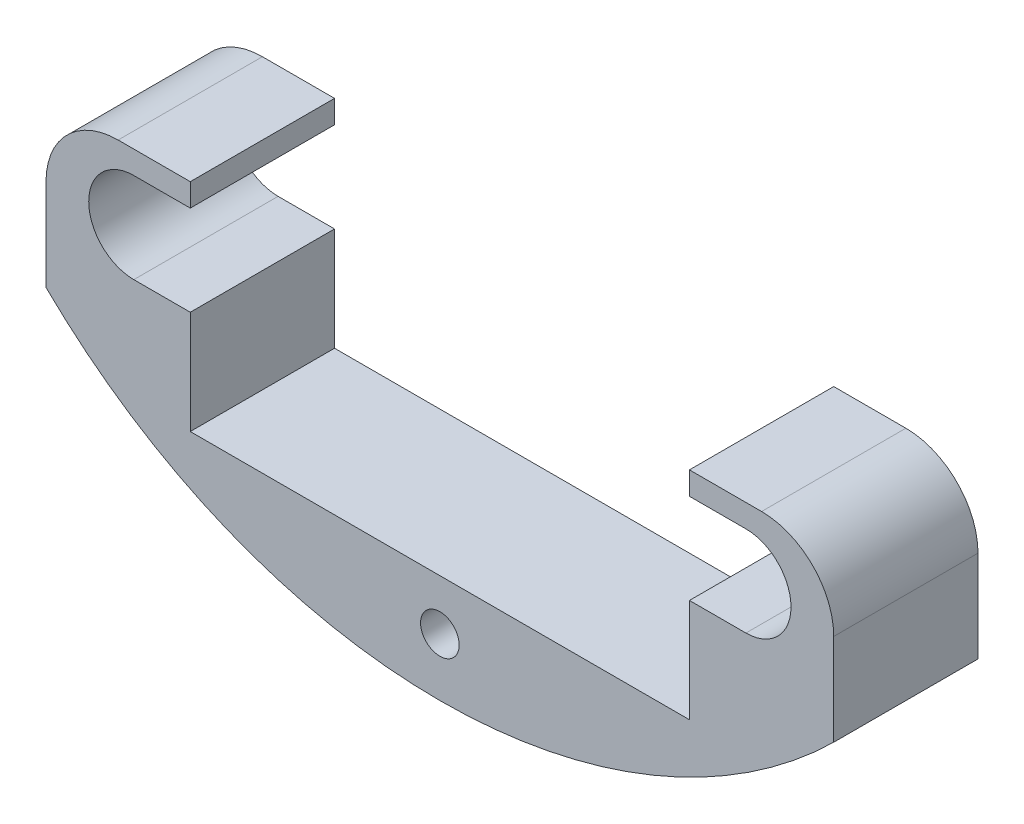
ISO-10303-21;
HEADER;
FILE_DESCRIPTION(('STEP AP214'),'2;1');
FILE_NAME('part.step','',(''),(''),'','','');
FILE_SCHEMA(('AUTOMOTIVE_DESIGN { 1 0 10303 214 1 1 1 1 }'));
ENDSEC;
DATA;
#1=APPLICATION_CONTEXT('core data for automotive mechanical design processes');
#2=APPLICATION_PROTOCOL_DEFINITION('international standard','automotive_design',2000,#1);
#3=PRODUCT_CONTEXT('',#1,'mechanical');
#4=PRODUCT('Part','Part','',(#3));
#5=PRODUCT_RELATED_PRODUCT_CATEGORY('part','',(#4));
#6=PRODUCT_DEFINITION_FORMATION('','',#4);
#7=PRODUCT_DEFINITION_CONTEXT('part definition',#1,'design');
#8=PRODUCT_DEFINITION('design','',#6,#7);
#9=PRODUCT_DEFINITION_SHAPE('','',#8);
#10=(LENGTH_UNIT() NAMED_UNIT(*) SI_UNIT(.MILLI.,.METRE.));
#11=(NAMED_UNIT(*) PLANE_ANGLE_UNIT() SI_UNIT($,.RADIAN.));
#12=(NAMED_UNIT(*) SI_UNIT($,.STERADIAN.) SOLID_ANGLE_UNIT());
#13=UNCERTAINTY_MEASURE_WITH_UNIT(LENGTH_MEASURE(1.E-05),#10,'distance_accuracy_value','');
#14=(GEOMETRIC_REPRESENTATION_CONTEXT(3) GLOBAL_UNCERTAINTY_ASSIGNED_CONTEXT((#13)) GLOBAL_UNIT_ASSIGNED_CONTEXT((#10,
#11,#12)) REPRESENTATION_CONTEXT('',''));
#15=CARTESIAN_POINT('',(0.,0.,0.));
#16=DIRECTION('',(0.,0.,1.));
#17=DIRECTION('',(1.,0.,0.));
#18=AXIS2_PLACEMENT_3D('',#15,#16,#17);
#19=CARTESIAN_POINT('',(-34.671,-20.955,12.7));
#20=DIRECTION('',(0.,-1.,0.));
#21=DIRECTION('',(0.,0.,-1.));
#22=AXIS2_PLACEMENT_3D('',#19,#20,#21);
#23=PLANE('',#22);
#24=DIRECTION('',(-1.,0.,0.));
#25=VECTOR('',#24,1.);
#26=CARTESIAN_POINT('',(-34.671,-20.955,0.));
#27=LINE('',#26,#25);
#28=CARTESIAN_POINT('',(-21.971,-20.955,0.));
#29=VERTEX_POINT('',#28);
#30=CARTESIAN_POINT('',(-28.321,-20.955,0.));
#31=VERTEX_POINT('',#30);
#32=EDGE_CURVE('E178',#29,#31,#27,.T.);
#33=ORIENTED_EDGE('',*,*,#32,.T.);
#34=DIRECTION('',(0.,0.,-1.));
#35=VECTOR('',#34,1.);
#36=CARTESIAN_POINT('',(-28.321,-20.955,12.7));
#37=LINE('',#36,#35);
#38=CARTESIAN_POINT('',(-28.321,-20.955,12.7));
#39=VERTEX_POINT('',#38);
#40=EDGE_CURVE('E11',#31,#39,#37,.F.);
#41=ORIENTED_EDGE('',*,*,#40,.T.);
#42=DIRECTION('',(-1.,0.,0.));
#43=VECTOR('',#42,1.);
#44=CARTESIAN_POINT('',(-34.671,-20.955,12.7));
#45=LINE('',#44,#43);
#46=CARTESIAN_POINT('',(-21.971,-20.955,12.7));
#47=VERTEX_POINT('',#46);
#48=EDGE_CURVE('E258',#47,#39,#45,.T.);
#49=ORIENTED_EDGE('',*,*,#48,.F.);
#50=DIRECTION('',(0.,0.,-1.));
#51=VECTOR('',#50,1.);
#52=CARTESIAN_POINT('',(-21.971,-20.955,12.7));
#53=LINE('',#52,#51);
#54=EDGE_CURVE('E287',#47,#29,#53,.T.);
#55=ORIENTED_EDGE('',*,*,#54,.T.);
#56=EDGE_LOOP('',(#33,#41,#49,#55));
#57=FACE_BOUND('',#56,.T.);
#58=ADVANCED_FACE('F39',(#57),#23,.F.);
#59=CARTESIAN_POINT('',(-34.671,-20.955,12.7));
#60=DIRECTION('',(1.,0.,0.));
#61=DIRECTION('',(0.,1.,0.));
#62=AXIS2_PLACEMENT_3D('',#59,#60,#61);
#63=PLANE('',#62);
#64=DIRECTION('',(0.,-1.,0.));
#65=VECTOR('',#64,1.);
#66=CARTESIAN_POINT('',(-34.671,-20.955,12.7));
#67=LINE('',#66,#65);
#68=CARTESIAN_POINT('',(-34.671,-27.305,12.7));
#69=VERTEX_POINT('',#68);
#70=CARTESIAN_POINT('',(-34.671,-35.3714950065728,12.7));
#71=VERTEX_POINT('',#70);
#72=EDGE_CURVE('E261',#69,#71,#67,.T.);
#73=ORIENTED_EDGE('',*,*,#72,.F.);
#74=DIRECTION('',(0.,0.,-1.));
#75=VECTOR('',#74,1.);
#76=CARTESIAN_POINT('',(-34.671,-27.305,12.7));
#77=LINE('',#76,#75);
#78=CARTESIAN_POINT('',(-34.671,-27.305,0.));
#79=VERTEX_POINT('',#78);
#80=EDGE_CURVE('E48',#69,#79,#77,.T.);
#81=ORIENTED_EDGE('',*,*,#80,.T.);
#82=DIRECTION('',(0.,-1.,0.));
#83=VECTOR('',#82,1.);
#84=CARTESIAN_POINT('',(-34.671,-20.955,0.));
#85=LINE('',#84,#83);
#86=CARTESIAN_POINT('',(-34.671,-35.3714950065728,0.));
#87=VERTEX_POINT('',#86);
#88=EDGE_CURVE('E290',#79,#87,#85,.T.);
#89=ORIENTED_EDGE('',*,*,#88,.T.);
#90=DIRECTION('',(0.,0.,-1.));
#91=VECTOR('',#90,1.);
#92=CARTESIAN_POINT('',(-34.671,-35.3714950065728,12.7));
#93=LINE('',#92,#91);
#94=EDGE_CURVE('E337',#71,#87,#93,.T.);
#95=ORIENTED_EDGE('',*,*,#94,.F.);
#96=EDGE_LOOP('',(#73,#81,#89,#95));
#97=FACE_BOUND('',#96,.T.);
#98=ADVANCED_FACE('F361',(#97),#63,.F.);
#99=CARTESIAN_POINT('',(0.,0.,12.7));
#100=DIRECTION('',(0.,0.,-1.));
#101=DIRECTION('',(-1.,0.,0.));
#102=AXIS2_PLACEMENT_3D('',#99,#100,#101);
#103=CYLINDRICAL_SURFACE('',#102,49.53);
#104=CARTESIAN_POINT('',(0.,0.,0.));
#105=DIRECTION('',(0.,0.,1.));
#106=DIRECTION('',(-1.,0.,0.));
#107=AXIS2_PLACEMENT_3D('',#104,#105,#106);
#108=CIRCLE('',#107,49.53);
#109=CARTESIAN_POINT('',(34.671,-35.3714950065727,0.));
#110=VERTEX_POINT('',#109);
#111=EDGE_CURVE('E293',#87,#110,#108,.T.);
#112=ORIENTED_EDGE('',*,*,#111,.T.);
#113=DIRECTION('',(0.,0.,-1.));
#114=VECTOR('',#113,1.);
#115=CARTESIAN_POINT('',(34.671,-35.3714950065727,12.7));
#116=LINE('',#115,#114);
#117=CARTESIAN_POINT('',(34.671,-35.3714950065727,12.7));
#118=VERTEX_POINT('',#117);
#119=EDGE_CURVE('E215',#118,#110,#116,.T.);
#120=ORIENTED_EDGE('',*,*,#119,.F.);
#121=CARTESIAN_POINT('',(0.,0.,12.7));
#122=DIRECTION('',(0.,0.,1.));
#123=DIRECTION('',(-1.,0.,0.));
#124=AXIS2_PLACEMENT_3D('',#121,#122,#123);
#125=CIRCLE('',#124,49.53);
#126=EDGE_CURVE('E265',#71,#118,#125,.T.);
#127=ORIENTED_EDGE('',*,*,#126,.F.);
#128=ORIENTED_EDGE('',*,*,#94,.T.);
#129=EDGE_LOOP('',(#112,#120,#127,#128));
#130=FACE_BOUND('',#129,.T.);
#131=ADVANCED_FACE('F371',(#130),#103,.T.);
#132=CARTESIAN_POINT('',(-21.971,-40.005,12.7));
#133=DIRECTION('',(0.,-1.,0.));
#134=DIRECTION('',(0.,0.,-1.));
#135=AXIS2_PLACEMENT_3D('',#132,#133,#134);
#136=PLANE('',#135);
#137=DIRECTION('',(-1.,0.,0.));
#138=VECTOR('',#137,1.);
#139=CARTESIAN_POINT('',(-21.971,-40.005,0.));
#140=LINE('',#139,#138);
#141=CARTESIAN_POINT('',(21.971,-40.005,0.));
#142=VERTEX_POINT('',#141);
#143=CARTESIAN_POINT('',(-21.971,-40.005,0.));
#144=VERTEX_POINT('',#143);
#145=EDGE_CURVE('E297',#142,#144,#140,.T.);
#146=ORIENTED_EDGE('',*,*,#145,.T.);
#147=DIRECTION('',(0.,0.,-1.));
#148=VECTOR('',#147,1.);
#149=CARTESIAN_POINT('',(-21.971,-40.005,12.7));
#150=LINE('',#149,#148);
#151=CARTESIAN_POINT('',(-21.971,-40.005,12.7));
#152=VERTEX_POINT('',#151);
#153=EDGE_CURVE('E333',#152,#144,#150,.T.);
#154=ORIENTED_EDGE('',*,*,#153,.F.);
#155=DIRECTION('',(-1.,0.,0.));
#156=VECTOR('',#155,1.);
#157=CARTESIAN_POINT('',(-21.971,-40.005,12.7));
#158=LINE('',#157,#156);
#159=CARTESIAN_POINT('',(21.971,-40.005,12.7));
#160=VERTEX_POINT('',#159);
#161=EDGE_CURVE('E269',#160,#152,#158,.T.);
#162=ORIENTED_EDGE('',*,*,#161,.F.);
#163=DIRECTION('',(0.,0.,-1.));
#164=VECTOR('',#163,1.);
#165=CARTESIAN_POINT('',(21.971,-40.005,12.7));
#166=LINE('',#165,#164);
#167=EDGE_CURVE('E243',#160,#142,#166,.T.);
#168=ORIENTED_EDGE('',*,*,#167,.T.);
#169=EDGE_LOOP('',(#146,#154,#162,#168));
#170=FACE_BOUND('',#169,.T.);
#171=ADVANCED_FACE('F395',(#170),#136,.F.);
#172=CARTESIAN_POINT('',(-21.971,-30.9095183632075,12.7));
#173=DIRECTION('',(-1.,0.,0.));
#174=DIRECTION('',(0.,0.,1.));
#175=AXIS2_PLACEMENT_3D('',#172,#173,#174);
#176=PLANE('',#175);
#177=DIRECTION('',(0.,1.,0.));
#178=VECTOR('',#177,1.);
#179=CARTESIAN_POINT('',(-21.971,-30.9095183632075,0.));
#180=LINE('',#179,#178);
#181=CARTESIAN_POINT('',(-21.971,-30.9095183632075,0.));
#182=VERTEX_POINT('',#181);
#183=EDGE_CURVE('E300',#144,#182,#180,.T.);
#184=ORIENTED_EDGE('',*,*,#183,.T.);
#185=DIRECTION('',(0.,0.,-1.));
#186=VECTOR('',#185,1.);
#187=CARTESIAN_POINT('',(-21.971,-30.9095183632075,12.7));
#188=LINE('',#187,#186);
#189=CARTESIAN_POINT('',(-21.971,-30.9095183632075,12.7));
#190=VERTEX_POINT('',#189);
#191=EDGE_CURVE('E329',#190,#182,#188,.T.);
#192=ORIENTED_EDGE('',*,*,#191,.F.);
#193=DIRECTION('',(0.,1.,0.));
#194=VECTOR('',#193,1.);
#195=CARTESIAN_POINT('',(-21.971,-30.9095183632075,12.7));
#196=LINE('',#195,#194);
#197=EDGE_CURVE('E272',#152,#190,#196,.T.);
#198=ORIENTED_EDGE('',*,*,#197,.F.);
#199=ORIENTED_EDGE('',*,*,#153,.T.);
#200=EDGE_LOOP('',(#184,#192,#198,#199));
#201=FACE_BOUND('',#200,.T.);
#202=ADVANCED_FACE('F402',(#201),#176,.F.);
#203=CARTESIAN_POINT('',(-26.9407683632074,-30.9095183632075,12.7));
#204=DIRECTION('',(0.,-1.,0.));
#205=DIRECTION('',(1.,0.,0.));
#206=AXIS2_PLACEMENT_3D('',#203,#204,#205);
#207=PLANE('',#206);
#208=DIRECTION('',(-1.,0.,0.));
#209=VECTOR('',#208,1.);
#210=CARTESIAN_POINT('',(-26.9407683632074,-30.9095183632075,0.));
#211=LINE('',#210,#209);
#212=CARTESIAN_POINT('',(-26.9407683632074,-30.9095183632075,0.));
#213=VERTEX_POINT('',#212);
#214=EDGE_CURVE('E303',#182,#213,#211,.T.);
#215=ORIENTED_EDGE('',*,*,#214,.T.);
#216=DIRECTION('',(0.,0.,-1.));
#217=VECTOR('',#216,1.);
#218=CARTESIAN_POINT('',(-26.9407683632074,-30.9095183632075,12.7));
#219=LINE('',#218,#217);
#220=CARTESIAN_POINT('',(-26.9407683632074,-30.9095183632075,12.7));
#221=VERTEX_POINT('',#220);
#222=EDGE_CURVE('E325',#221,#213,#219,.T.);
#223=ORIENTED_EDGE('',*,*,#222,.F.);
#224=DIRECTION('',(-1.,0.,0.));
#225=VECTOR('',#224,1.);
#226=CARTESIAN_POINT('',(-26.9407683632074,-30.9095183632075,12.7));
#227=LINE('',#226,#225);
#228=EDGE_CURVE('E275',#190,#221,#227,.T.);
#229=ORIENTED_EDGE('',*,*,#228,.F.);
#230=ORIENTED_EDGE('',*,*,#191,.T.);
#231=EDGE_LOOP('',(#215,#223,#229,#230));
#232=FACE_BOUND('',#231,.T.);
#233=ADVANCED_FACE('F406',(#232),#207,.F.);
#234=CARTESIAN_POINT('',(-26.9407683632074,-26.9407683632075,12.7));
#235=DIRECTION('',(0.,0.,-1.));
#236=DIRECTION('',(-1.,0.,0.));
#237=AXIS2_PLACEMENT_3D('',#234,#235,#236);
#238=CYLINDRICAL_SURFACE('',#237,3.96875);
#239=CARTESIAN_POINT('',(-26.9407683632074,-26.9407683632075,0.));
#240=DIRECTION('',(0.,0.,-1.));
#241=DIRECTION('',(1.,0.,0.));
#242=AXIS2_PLACEMENT_3D('',#239,#240,#241);
#243=CIRCLE('',#242,3.96875);
#244=CARTESIAN_POINT('',(-26.9407683632074,-22.9720183632075,0.));
#245=VERTEX_POINT('',#244);
#246=EDGE_CURVE('E306',#213,#245,#243,.T.);
#247=ORIENTED_EDGE('',*,*,#246,.T.);
#248=DIRECTION('',(0.,0.,-1.));
#249=VECTOR('',#248,1.);
#250=CARTESIAN_POINT('',(-26.9407683632074,-22.9720183632075,12.7));
#251=LINE('',#250,#249);
#252=CARTESIAN_POINT('',(-26.9407683632074,-22.9720183632075,12.7));
#253=VERTEX_POINT('',#252);
#254=EDGE_CURVE('E321',#253,#245,#251,.T.);
#255=ORIENTED_EDGE('',*,*,#254,.F.);
#256=CARTESIAN_POINT('',(-26.9407683632074,-26.9407683632075,12.7));
#257=DIRECTION('',(0.,0.,-1.));
#258=DIRECTION('',(1.,0.,0.));
#259=AXIS2_PLACEMENT_3D('',#256,#257,#258);
#260=CIRCLE('',#259,3.96875);
#261=EDGE_CURVE('E278',#221,#253,#260,.T.);
#262=ORIENTED_EDGE('',*,*,#261,.F.);
#263=ORIENTED_EDGE('',*,*,#222,.T.);
#264=EDGE_LOOP('',(#247,#255,#262,#263));
#265=FACE_BOUND('',#264,.T.);
#266=ADVANCED_FACE('F411',(#265),#238,.F.);
#267=CARTESIAN_POINT('',(-26.9407683632074,-22.9720183632075,12.7));
#268=DIRECTION('',(0.,1.,0.));
#269=DIRECTION('',(-1.,0.,0.));
#270=AXIS2_PLACEMENT_3D('',#267,#268,#269);
#271=PLANE('',#270);
#272=DIRECTION('',(1.,0.,0.));
#273=VECTOR('',#272,1.);
#274=CARTESIAN_POINT('',(-26.9407683632074,-22.9720183632075,0.));
#275=LINE('',#274,#273);
#276=CARTESIAN_POINT('',(-21.971,-22.9720183632075,0.));
#277=VERTEX_POINT('',#276);
#278=EDGE_CURVE('E309',#245,#277,#275,.T.);
#279=ORIENTED_EDGE('',*,*,#278,.T.);
#280=DIRECTION('',(0.,0.,-1.));
#281=VECTOR('',#280,1.);
#282=CARTESIAN_POINT('',(-21.971,-22.9720183632075,12.7));
#283=LINE('',#282,#281);
#284=CARTESIAN_POINT('',(-21.971,-22.9720183632075,12.7));
#285=VERTEX_POINT('',#284);
#286=EDGE_CURVE('E317',#285,#277,#283,.T.);
#287=ORIENTED_EDGE('',*,*,#286,.F.);
#288=DIRECTION('',(1.,0.,0.));
#289=VECTOR('',#288,1.);
#290=CARTESIAN_POINT('',(-26.9407683632074,-22.9720183632075,12.7));
#291=LINE('',#290,#289);
#292=EDGE_CURVE('E281',#253,#285,#291,.T.);
#293=ORIENTED_EDGE('',*,*,#292,.F.);
#294=ORIENTED_EDGE('',*,*,#254,.T.);
#295=EDGE_LOOP('',(#279,#287,#293,#294));
#296=FACE_BOUND('',#295,.T.);
#297=ADVANCED_FACE('F417',(#296),#271,.F.);
#298=CARTESIAN_POINT('',(-21.971,-20.955,12.7));
#299=DIRECTION('',(-1.,0.,0.));
#300=DIRECTION('',(0.,-1.,0.));
#301=AXIS2_PLACEMENT_3D('',#298,#299,#300);
#302=PLANE('',#301);
#303=DIRECTION('',(0.,1.,0.));
#304=VECTOR('',#303,1.);
#305=CARTESIAN_POINT('',(-21.971,-20.955,0.));
#306=LINE('',#305,#304);
#307=EDGE_CURVE('E262',#277,#29,#306,.T.);
#308=ORIENTED_EDGE('',*,*,#307,.T.);
#309=ORIENTED_EDGE('',*,*,#54,.F.);
#310=DIRECTION('',(0.,1.,0.));
#311=VECTOR('',#310,1.);
#312=CARTESIAN_POINT('',(-21.971,-20.955,12.7));
#313=LINE('',#312,#311);
#314=EDGE_CURVE('E284',#285,#47,#313,.T.);
#315=ORIENTED_EDGE('',*,*,#314,.F.);
#316=ORIENTED_EDGE('',*,*,#286,.T.);
#317=EDGE_LOOP('',(#308,#309,#315,#316));
#318=FACE_BOUND('',#317,.T.);
#319=ADVANCED_FACE('F421',(#318),#302,.F.);
#320=CARTESIAN_POINT('',(-26.9407683632074,-26.9407683632075,12.7));
#321=DIRECTION('',(0.,0.,1.));
#322=DIRECTION('',(1.,0.,0.));
#323=AXIS2_PLACEMENT_3D('',#320,#321,#322);
#324=PLANE('',#323);
#325=CARTESIAN_POINT('',(0.,-44.45,12.7));
#326=DIRECTION('',(0.,0.,1.));
#327=DIRECTION('',(1.,0.,0.));
#328=AXIS2_PLACEMENT_3D('',#325,#326,#327);
#329=CIRCLE('',#328,1.7);
#330=CARTESIAN_POINT('',(1.7,-44.45,12.7));
#331=VERTEX_POINT('',#330);
#332=EDGE_CURVE('E606',#331,#331,#329,.T.);
#333=ORIENTED_EDGE('',*,*,#332,.F.);
#334=EDGE_LOOP('',(#333));
#335=FACE_BOUND('',#334,.T.);
#336=DIRECTION('',(0.,-1.,0.));
#337=VECTOR('',#336,1.);
#338=CARTESIAN_POINT('',(34.671,-20.955,12.7));
#339=LINE('',#338,#337);
#340=CARTESIAN_POINT('',(34.671,-27.305,12.7));
#341=VERTEX_POINT('',#340);
#342=EDGE_CURVE('E212',#341,#118,#339,.T.);
#343=ORIENTED_EDGE('',*,*,#342,.F.);
#344=CARTESIAN_POINT('',(28.321,-27.305,12.7));
#345=DIRECTION('',(0.,0.,1.));
#346=DIRECTION('',(1.,0.,0.));
#347=AXIS2_PLACEMENT_3D('',#344,#345,#346);
#348=CIRCLE('',#347,6.35);
#349=CARTESIAN_POINT('',(28.321,-20.955,12.7));
#350=VERTEX_POINT('',#349);
#351=EDGE_CURVE('E188',#341,#350,#348,.T.);
#352=ORIENTED_EDGE('',*,*,#351,.T.);
#353=DIRECTION('',(1.,0.,0.));
#354=VECTOR('',#353,1.);
#355=CARTESIAN_POINT('',(34.671,-20.955,12.7));
#356=LINE('',#355,#354);
#357=CARTESIAN_POINT('',(21.971,-20.955,12.7));
#358=VERTEX_POINT('',#357);
#359=EDGE_CURVE('E169',#358,#350,#356,.T.);
#360=ORIENTED_EDGE('',*,*,#359,.F.);
#361=DIRECTION('',(0.,1.,0.));
#362=VECTOR('',#361,1.);
#363=CARTESIAN_POINT('',(21.971,-20.955,12.7));
#364=LINE('',#363,#362);
#365=CARTESIAN_POINT('',(21.971,-22.9720183632075,12.7));
#366=VERTEX_POINT('',#365);
#367=EDGE_CURVE('E185',#366,#358,#364,.T.);
#368=ORIENTED_EDGE('',*,*,#367,.F.);
#369=DIRECTION('',(-1.,0.,0.));
#370=VECTOR('',#369,1.);
#371=CARTESIAN_POINT('',(26.9407683632074,-22.9720183632075,12.7));
#372=LINE('',#371,#370);
#373=CARTESIAN_POINT('',(26.9407683632074,-22.9720183632075,12.7));
#374=VERTEX_POINT('',#373);
#375=EDGE_CURVE('E194',#374,#366,#372,.T.);
#376=ORIENTED_EDGE('',*,*,#375,.F.);
#377=CARTESIAN_POINT('',(26.9407683632074,-26.9407683632075,12.7));
#378=DIRECTION('',(0.,0.,1.));
#379=DIRECTION('',(-1.,0.,0.));
#380=AXIS2_PLACEMENT_3D('',#377,#378,#379);
#381=CIRCLE('',#380,3.96875);
#382=CARTESIAN_POINT('',(26.9407683632074,-30.9095183632075,12.7));
#383=VERTEX_POINT('',#382);
#384=EDGE_CURVE('E197',#383,#374,#381,.T.);
#385=ORIENTED_EDGE('',*,*,#384,.F.);
#386=DIRECTION('',(1.,0.,0.));
#387=VECTOR('',#386,1.);
#388=CARTESIAN_POINT('',(26.9407683632074,-30.9095183632075,12.7));
#389=LINE('',#388,#387);
#390=CARTESIAN_POINT('',(21.971,-30.9095183632075,12.7));
#391=VERTEX_POINT('',#390);
#392=EDGE_CURVE('E204',#391,#383,#389,.T.);
#393=ORIENTED_EDGE('',*,*,#392,.F.);
#394=DIRECTION('',(0.,1.,0.));
#395=VECTOR('',#394,1.);
#396=CARTESIAN_POINT('',(21.971,-30.9095183632075,12.7));
#397=LINE('',#396,#395);
#398=EDGE_CURVE('E208',#160,#391,#397,.T.);
#399=ORIENTED_EDGE('',*,*,#398,.F.);
#400=ORIENTED_EDGE('',*,*,#161,.T.);
#401=ORIENTED_EDGE('',*,*,#197,.T.);
#402=ORIENTED_EDGE('',*,*,#228,.T.);
#403=ORIENTED_EDGE('',*,*,#261,.T.);
#404=ORIENTED_EDGE('',*,*,#292,.T.);
#405=ORIENTED_EDGE('',*,*,#314,.T.);
#406=ORIENTED_EDGE('',*,*,#48,.T.);
#407=CARTESIAN_POINT('',(-28.321,-27.305,12.7));
#408=DIRECTION('',(0.,0.,1.));
#409=DIRECTION('',(1.,0.,0.));
#410=AXIS2_PLACEMENT_3D('',#407,#408,#409);
#411=CIRCLE('',#410,6.35);
#412=EDGE_CURVE('E55',#39,#69,#411,.T.);
#413=ORIENTED_EDGE('',*,*,#412,.T.);
#414=ORIENTED_EDGE('',*,*,#72,.T.);
#415=ORIENTED_EDGE('',*,*,#126,.T.);
#416=EDGE_LOOP('',(#343,#352,#360,#368,#376,#385,#393,#399,#400,#401,#402,#403,#404,#405,#406,
#413,#414,#415));
#417=FACE_BOUND('',#416,.T.);
#418=ADVANCED_FACE('F183',(#335,#417),#324,.T.);
#419=CARTESIAN_POINT('',(-26.9407683632074,-26.9407683632075,0.));
#420=DIRECTION('',(0.,0.,1.));
#421=DIRECTION('',(1.,0.,0.));
#422=AXIS2_PLACEMENT_3D('',#419,#420,#421);
#423=PLANE('',#422);
#424=CARTESIAN_POINT('',(0.,-44.45,0.));
#425=DIRECTION('',(0.,0.,1.));
#426=DIRECTION('',(1.,0.,0.));
#427=AXIS2_PLACEMENT_3D('',#424,#425,#426);
#428=CIRCLE('',#427,1.7);
#429=CARTESIAN_POINT('',(1.7,-44.45,0.));
#430=VERTEX_POINT('',#429);
#431=EDGE_CURVE('E219',#430,#430,#428,.T.);
#432=ORIENTED_EDGE('',*,*,#431,.T.);
#433=EDGE_LOOP('',(#432));
#434=FACE_BOUND('',#433,.T.);
#435=DIRECTION('',(1.,0.,0.));
#436=VECTOR('',#435,1.);
#437=CARTESIAN_POINT('',(34.671,-20.955,0.));
#438=LINE('',#437,#436);
#439=CARTESIAN_POINT('',(21.971,-20.955,0.));
#440=VERTEX_POINT('',#439);
#441=CARTESIAN_POINT('',(28.321,-20.955,0.));
#442=VERTEX_POINT('',#441);
#443=EDGE_CURVE('E172',#440,#442,#438,.T.);
#444=ORIENTED_EDGE('',*,*,#443,.T.);
#445=CARTESIAN_POINT('',(28.321,-27.305,0.));
#446=DIRECTION('',(0.,0.,1.));
#447=DIRECTION('',(1.,0.,0.));
#448=AXIS2_PLACEMENT_3D('',#445,#446,#447);
#449=CIRCLE('',#448,6.35);
#450=CARTESIAN_POINT('',(34.671,-27.305,0.));
#451=VERTEX_POINT('',#450);
#452=EDGE_CURVE('E347',#442,#451,#449,.F.);
#453=ORIENTED_EDGE('',*,*,#452,.T.);
#454=DIRECTION('',(0.,-1.,0.));
#455=VECTOR('',#454,1.);
#456=CARTESIAN_POINT('',(34.671,-20.955,0.));
#457=LINE('',#456,#455);
#458=EDGE_CURVE('E190',#451,#110,#457,.T.);
#459=ORIENTED_EDGE('',*,*,#458,.T.);
#460=ORIENTED_EDGE('',*,*,#111,.F.);
#461=ORIENTED_EDGE('',*,*,#88,.F.);
#462=CARTESIAN_POINT('',(-28.321,-27.305,0.));
#463=DIRECTION('',(0.,0.,1.));
#464=DIRECTION('',(1.,0.,0.));
#465=AXIS2_PLACEMENT_3D('',#462,#463,#464);
#466=CIRCLE('',#465,6.35);
#467=EDGE_CURVE('E344',#79,#31,#466,.F.);
#468=ORIENTED_EDGE('',*,*,#467,.T.);
#469=ORIENTED_EDGE('',*,*,#32,.F.);
#470=ORIENTED_EDGE('',*,*,#307,.F.);
#471=ORIENTED_EDGE('',*,*,#278,.F.);
#472=ORIENTED_EDGE('',*,*,#246,.F.);
#473=ORIENTED_EDGE('',*,*,#214,.F.);
#474=ORIENTED_EDGE('',*,*,#183,.F.);
#475=ORIENTED_EDGE('',*,*,#145,.F.);
#476=DIRECTION('',(0.,1.,0.));
#477=VECTOR('',#476,1.);
#478=CARTESIAN_POINT('',(21.971,-30.9095183632075,0.));
#479=LINE('',#478,#477);
#480=CARTESIAN_POINT('',(21.971,-30.9095183632075,0.));
#481=VERTEX_POINT('',#480);
#482=EDGE_CURVE('E234',#142,#481,#479,.T.);
#483=ORIENTED_EDGE('',*,*,#482,.T.);
#484=DIRECTION('',(1.,0.,0.));
#485=VECTOR('',#484,1.);
#486=CARTESIAN_POINT('',(26.9407683632074,-30.9095183632075,0.));
#487=LINE('',#486,#485);
#488=CARTESIAN_POINT('',(26.9407683632074,-30.9095183632075,0.));
#489=VERTEX_POINT('',#488);
#490=EDGE_CURVE('E230',#481,#489,#487,.T.);
#491=ORIENTED_EDGE('',*,*,#490,.T.);
#492=CARTESIAN_POINT('',(26.9407683632074,-26.9407683632075,0.));
#493=DIRECTION('',(0.,0.,1.));
#494=DIRECTION('',(-1.,0.,0.));
#495=AXIS2_PLACEMENT_3D('',#492,#493,#494);
#496=CIRCLE('',#495,3.96875);
#497=CARTESIAN_POINT('',(26.9407683632074,-22.9720183632075,0.));
#498=VERTEX_POINT('',#497);
#499=EDGE_CURVE('E226',#489,#498,#496,.T.);
#500=ORIENTED_EDGE('',*,*,#499,.T.);
#501=DIRECTION('',(-1.,0.,0.));
#502=VECTOR('',#501,1.);
#503=CARTESIAN_POINT('',(26.9407683632074,-22.9720183632075,0.));
#504=LINE('',#503,#502);
#505=CARTESIAN_POINT('',(21.971,-22.9720183632075,0.));
#506=VERTEX_POINT('',#505);
#507=EDGE_CURVE('E222',#498,#506,#504,.T.);
#508=ORIENTED_EDGE('',*,*,#507,.T.);
#509=DIRECTION('',(0.,1.,0.));
#510=VECTOR('',#509,1.);
#511=CARTESIAN_POINT('',(21.971,-20.955,0.));
#512=LINE('',#511,#510);
#513=EDGE_CURVE('E218',#506,#440,#512,.T.);
#514=ORIENTED_EDGE('',*,*,#513,.T.);
#515=EDGE_LOOP('',(#444,#453,#459,#460,#461,#468,#469,#470,#471,#472,#473,#474,#475,#483,#491,
#500,#508,#514));
#516=FACE_BOUND('',#515,.T.);
#517=ADVANCED_FACE('F366',(#434,#516),#423,.F.);
#518=CARTESIAN_POINT('',(34.671,-20.955,12.7));
#519=DIRECTION('',(0.,1.,0.));
#520=DIRECTION('',(-1.,0.,0.));
#521=AXIS2_PLACEMENT_3D('',#518,#519,#520);
#522=PLANE('',#521);
#523=ORIENTED_EDGE('',*,*,#359,.T.);
#524=DIRECTION('',(0.,0.,-1.));
#525=VECTOR('',#524,1.);
#526=CARTESIAN_POINT('',(28.321,-20.955,12.7));
#527=LINE('',#526,#525);
#528=EDGE_CURVE('E341',#350,#442,#527,.T.);
#529=ORIENTED_EDGE('',*,*,#528,.T.);
#530=ORIENTED_EDGE('',*,*,#443,.F.);
#531=DIRECTION('',(0.,0.,-1.));
#532=VECTOR('',#531,1.);
#533=CARTESIAN_POINT('',(21.971,-20.955,12.7));
#534=LINE('',#533,#532);
#535=EDGE_CURVE('E165',#358,#440,#534,.T.);
#536=ORIENTED_EDGE('',*,*,#535,.F.);
#537=EDGE_LOOP('',(#523,#529,#530,#536));
#538=FACE_BOUND('',#537,.T.);
#539=ADVANCED_FACE('F167',(#538),#522,.T.);
#540=CARTESIAN_POINT('',(21.971,-20.955,12.7));
#541=DIRECTION('',(-1.,0.,0.));
#542=DIRECTION('',(0.,-1.,0.));
#543=AXIS2_PLACEMENT_3D('',#540,#541,#542);
#544=PLANE('',#543);
#545=ORIENTED_EDGE('',*,*,#513,.F.);
#546=DIRECTION('',(0.,0.,-1.));
#547=VECTOR('',#546,1.);
#548=CARTESIAN_POINT('',(21.971,-22.9720183632075,12.7));
#549=LINE('',#548,#547);
#550=EDGE_CURVE('E179',#366,#506,#549,.T.);
#551=ORIENTED_EDGE('',*,*,#550,.F.);
#552=ORIENTED_EDGE('',*,*,#367,.T.);
#553=ORIENTED_EDGE('',*,*,#535,.T.);
#554=EDGE_LOOP('',(#545,#551,#552,#553));
#555=FACE_BOUND('',#554,.T.);
#556=ADVANCED_FACE('F192',(#555),#544,.T.);
#557=CARTESIAN_POINT('',(26.9407683632074,-22.9720183632075,12.7));
#558=DIRECTION('',(0.,-1.,0.));
#559=DIRECTION('',(1.,0.,0.));
#560=AXIS2_PLACEMENT_3D('',#557,#558,#559);
#561=PLANE('',#560);
#562=ORIENTED_EDGE('',*,*,#507,.F.);
#563=DIRECTION('',(0.,0.,-1.));
#564=VECTOR('',#563,1.);
#565=CARTESIAN_POINT('',(26.9407683632074,-22.9720183632075,12.7));
#566=LINE('',#565,#564);
#567=EDGE_CURVE('E253',#374,#498,#566,.T.);
#568=ORIENTED_EDGE('',*,*,#567,.F.);
#569=ORIENTED_EDGE('',*,*,#375,.T.);
#570=ORIENTED_EDGE('',*,*,#550,.T.);
#571=EDGE_LOOP('',(#562,#568,#569,#570));
#572=FACE_BOUND('',#571,.T.);
#573=ADVANCED_FACE('F381',(#572),#561,.T.);
#574=CARTESIAN_POINT('',(26.9407683632074,-26.9407683632075,12.7));
#575=DIRECTION('',(0.,0.,-1.));
#576=DIRECTION('',(-1.,0.,0.));
#577=AXIS2_PLACEMENT_3D('',#574,#575,#576);
#578=CYLINDRICAL_SURFACE('',#577,3.96875);
#579=ORIENTED_EDGE('',*,*,#499,.F.);
#580=DIRECTION('',(0.,0.,-1.));
#581=VECTOR('',#580,1.);
#582=CARTESIAN_POINT('',(26.9407683632074,-30.9095183632075,12.7));
#583=LINE('',#582,#581);
#584=EDGE_CURVE('E250',#383,#489,#583,.T.);
#585=ORIENTED_EDGE('',*,*,#584,.F.);
#586=ORIENTED_EDGE('',*,*,#384,.T.);
#587=ORIENTED_EDGE('',*,*,#567,.T.);
#588=EDGE_LOOP('',(#579,#585,#586,#587));
#589=FACE_BOUND('',#588,.T.);
#590=ADVANCED_FACE('F385',(#589),#578,.F.);
#591=CARTESIAN_POINT('',(26.9407683632074,-30.9095183632075,12.7));
#592=DIRECTION('',(0.,1.,0.));
#593=DIRECTION('',(-1.,0.,0.));
#594=AXIS2_PLACEMENT_3D('',#591,#592,#593);
#595=PLANE('',#594);
#596=ORIENTED_EDGE('',*,*,#490,.F.);
#597=DIRECTION('',(0.,0.,-1.));
#598=VECTOR('',#597,1.);
#599=CARTESIAN_POINT('',(21.971,-30.9095183632075,12.7));
#600=LINE('',#599,#598);
#601=EDGE_CURVE('E247',#391,#481,#600,.T.);
#602=ORIENTED_EDGE('',*,*,#601,.F.);
#603=ORIENTED_EDGE('',*,*,#392,.T.);
#604=ORIENTED_EDGE('',*,*,#584,.T.);
#605=EDGE_LOOP('',(#596,#602,#603,#604));
#606=FACE_BOUND('',#605,.T.);
#607=ADVANCED_FACE('F388',(#606),#595,.T.);
#608=CARTESIAN_POINT('',(21.971,-30.9095183632075,12.7));
#609=DIRECTION('',(-1.,0.,0.));
#610=DIRECTION('',(0.,-1.,0.));
#611=AXIS2_PLACEMENT_3D('',#608,#609,#610);
#612=PLANE('',#611);
#613=ORIENTED_EDGE('',*,*,#482,.F.);
#614=ORIENTED_EDGE('',*,*,#167,.F.);
#615=ORIENTED_EDGE('',*,*,#398,.T.);
#616=ORIENTED_EDGE('',*,*,#601,.T.);
#617=EDGE_LOOP('',(#613,#614,#615,#616));
#618=FACE_BOUND('',#617,.T.);
#619=ADVANCED_FACE('F393',(#618),#612,.T.);
#620=CARTESIAN_POINT('',(34.671,-20.955,12.7));
#621=DIRECTION('',(1.,0.,0.));
#622=DIRECTION('',(0.,1.,0.));
#623=AXIS2_PLACEMENT_3D('',#620,#621,#622);
#624=PLANE('',#623);
#625=ORIENTED_EDGE('',*,*,#458,.F.);
#626=DIRECTION('',(0.,0.,-1.));
#627=VECTOR('',#626,1.);
#628=CARTESIAN_POINT('',(34.671,-27.305,12.7));
#629=LINE('',#628,#627);
#630=EDGE_CURVE('E350',#451,#341,#629,.F.);
#631=ORIENTED_EDGE('',*,*,#630,.T.);
#632=ORIENTED_EDGE('',*,*,#342,.T.);
#633=ORIENTED_EDGE('',*,*,#119,.T.);
#634=EDGE_LOOP('',(#625,#631,#632,#633));
#635=FACE_BOUND('',#634,.T.);
#636=ADVANCED_FACE('F374',(#635),#624,.T.);
#637=CARTESIAN_POINT('',(28.321,-27.305,12.7));
#638=DIRECTION('',(0.,0.,-1.));
#639=DIRECTION('',(-1.,0.,0.));
#640=AXIS2_PLACEMENT_3D('',#637,#638,#639);
#641=CYLINDRICAL_SURFACE('',#640,6.35);
#642=ORIENTED_EDGE('',*,*,#351,.F.);
#643=ORIENTED_EDGE('',*,*,#630,.F.);
#644=ORIENTED_EDGE('',*,*,#452,.F.);
#645=ORIENTED_EDGE('',*,*,#528,.F.);
#646=EDGE_LOOP('',(#642,#643,#644,#645));
#647=FACE_BOUND('',#646,.T.);
#648=ADVANCED_FACE('F377',(#647),#641,.T.);
#649=CARTESIAN_POINT('',(-28.321,-27.305,12.7));
#650=DIRECTION('',(0.,0.,-1.));
#651=DIRECTION('',(-1.,0.,0.));
#652=AXIS2_PLACEMENT_3D('',#649,#650,#651);
#653=CYLINDRICAL_SURFACE('',#652,6.35);
#654=ORIENTED_EDGE('',*,*,#412,.F.);
#655=ORIENTED_EDGE('',*,*,#40,.F.);
#656=ORIENTED_EDGE('',*,*,#467,.F.);
#657=ORIENTED_EDGE('',*,*,#80,.F.);
#658=EDGE_LOOP('',(#654,#655,#656,#657));
#659=FACE_BOUND('',#658,.T.);
#660=ADVANCED_FACE('F41',(#659),#653,.T.);
#661=CARTESIAN_POINT('',(0.,-44.45,12.7));
#662=DIRECTION('',(0.,0.,1.));
#663=DIRECTION('',(1.,0.,0.));
#664=AXIS2_PLACEMENT_3D('',#661,#662,#663);
#665=CYLINDRICAL_SURFACE('',#664,1.7);
#666=ORIENTED_EDGE('',*,*,#431,.F.);
#667=EDGE_LOOP('',(#666));
#668=FACE_BOUND('',#667,.T.);
#669=ORIENTED_EDGE('',*,*,#332,.T.);
#670=EDGE_LOOP('',(#669));
#671=FACE_BOUND('',#670,.T.);
#672=ADVANCED_FACE('F423',(#668,#671),#665,.F.);
#673=CLOSED_SHELL('',(#58,#98,#131,#171,#202,#233,#266,#297,#319,#418,#517,#539,#556,#573,#590,
#607,#619,#636,#648,#660,#672));
#674=MANIFOLD_SOLID_BREP('B2',#673);
#675=ADVANCED_BREP_SHAPE_REPRESENTATION('',(#18,#674),#14);
#676=SHAPE_DEFINITION_REPRESENTATION(#9,#675);
ENDSEC;
END-ISO-10303-21;
